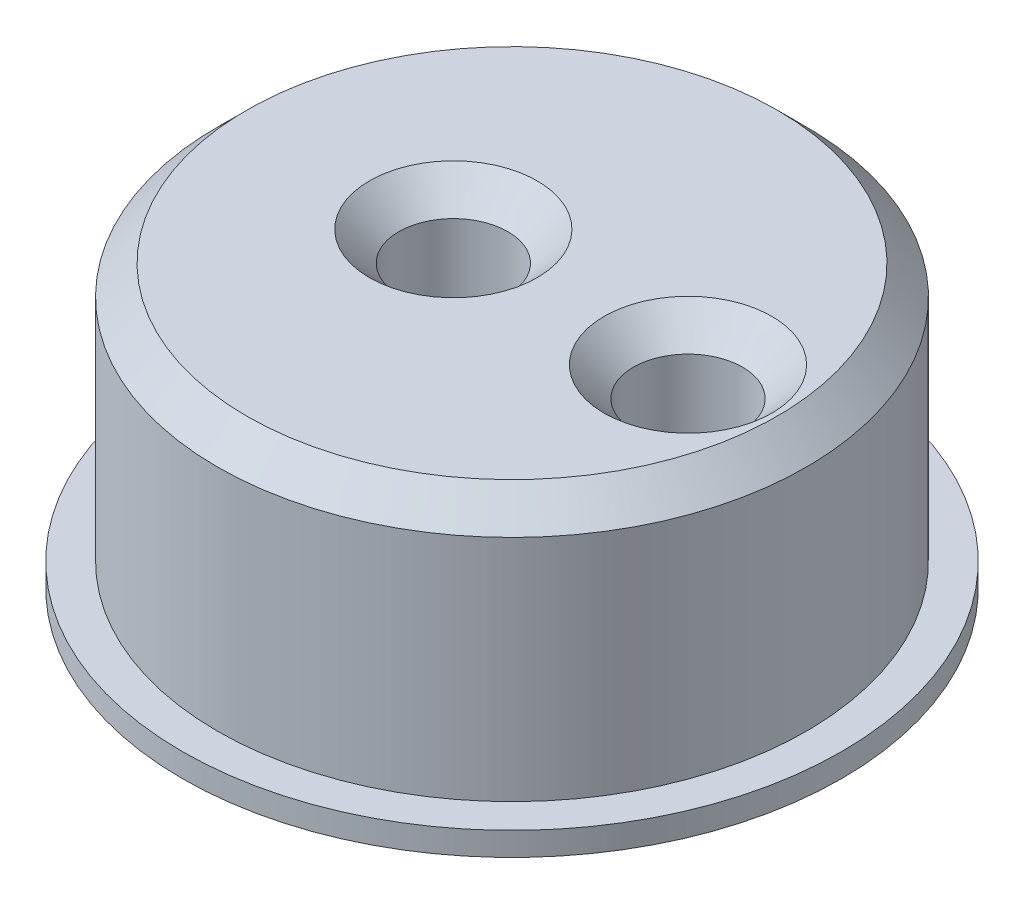
ISO-10303-21;
HEADER;
FILE_DESCRIPTION(('STEP AP214'),'2;1');
FILE_NAME('part.step','',(''),(''),'','','');
FILE_SCHEMA(('AUTOMOTIVE_DESIGN { 1 0 10303 214 1 1 1 1 }'));
ENDSEC;
DATA;
#1=APPLICATION_CONTEXT('core data for automotive mechanical design processes');
#2=APPLICATION_PROTOCOL_DEFINITION('international standard','automotive_design',2000,#1);
#3=PRODUCT_CONTEXT('',#1,'mechanical');
#4=PRODUCT('Part','Part','',(#3));
#5=PRODUCT_RELATED_PRODUCT_CATEGORY('part','',(#4));
#6=PRODUCT_DEFINITION_FORMATION('','',#4);
#7=PRODUCT_DEFINITION_CONTEXT('part definition',#1,'design');
#8=PRODUCT_DEFINITION('design','',#6,#7);
#9=PRODUCT_DEFINITION_SHAPE('','',#8);
#10=(LENGTH_UNIT() NAMED_UNIT(*) SI_UNIT(.MILLI.,.METRE.));
#11=(NAMED_UNIT(*) PLANE_ANGLE_UNIT() SI_UNIT($,.RADIAN.));
#12=(NAMED_UNIT(*) SI_UNIT($,.STERADIAN.) SOLID_ANGLE_UNIT());
#13=UNCERTAINTY_MEASURE_WITH_UNIT(LENGTH_MEASURE(1.E-05),#10,'distance_accuracy_value','');
#14=(GEOMETRIC_REPRESENTATION_CONTEXT(3) GLOBAL_UNCERTAINTY_ASSIGNED_CONTEXT((#13)) GLOBAL_UNIT_ASSIGNED_CONTEXT((#10,
#11,#12)) REPRESENTATION_CONTEXT('',''));
#15=CARTESIAN_POINT('',(0.,0.,0.));
#16=DIRECTION('',(0.,0.,1.));
#17=DIRECTION('',(1.,0.,0.));
#18=AXIS2_PLACEMENT_3D('',#15,#16,#17);
#19=CARTESIAN_POINT('',(0.,4.4,0.));
#20=DIRECTION('',(0.,1.,0.));
#21=DIRECTION('',(0.,0.,1.));
#22=AXIS2_PLACEMENT_3D('',#19,#20,#21);
#23=PLANE('',#22);
#24=CARTESIAN_POINT('',(-1.,4.4,0.));
#25=DIRECTION('',(0.,1.,0.));
#26=DIRECTION('',(0.,0.,1.));
#27=AXIS2_PLACEMENT_3D('',#24,#25,#26);
#28=CIRCLE('',#27,1.43000000000001);
#29=CARTESIAN_POINT('',(-1.,4.4,1.43000000000001));
#30=VERTEX_POINT('',#29);
#31=EDGE_CURVE('E42',#30,#30,#28,.F.);
#32=ORIENTED_EDGE('',*,*,#31,.T.);
#33=EDGE_LOOP('',(#32));
#34=FACE_BOUND('',#33,.T.);
#35=CARTESIAN_POINT('',(0.,4.4,0.));
#36=DIRECTION('',(0.,1.,0.));
#37=DIRECTION('',(0.,0.,1.));
#38=AXIS2_PLACEMENT_3D('',#35,#36,#37);
#39=CIRCLE('',#38,4.52);
#40=CARTESIAN_POINT('',(0.,4.4,4.52));
#41=VERTEX_POINT('',#40);
#42=EDGE_CURVE('E46',#41,#41,#39,.T.);
#43=ORIENTED_EDGE('',*,*,#42,.T.);
#44=EDGE_LOOP('',(#43));
#45=FACE_BOUND('',#44,.T.);
#46=CARTESIAN_POINT('',(3.,4.4,0.));
#47=DIRECTION('',(0.,1.,0.));
#48=DIRECTION('',(0.,0.,1.));
#49=AXIS2_PLACEMENT_3D('',#46,#47,#48);
#50=CIRCLE('',#49,1.43);
#51=CARTESIAN_POINT('',(3.,4.4,1.43));
#52=VERTEX_POINT('',#51);
#53=EDGE_CURVE('E50',#52,#52,#50,.F.);
#54=ORIENTED_EDGE('',*,*,#53,.T.);
#55=EDGE_LOOP('',(#54));
#56=FACE_BOUND('',#55,.T.);
#57=ADVANCED_FACE('F34',(#34,#45,#56),#23,.T.);
#58=CARTESIAN_POINT('',(0.,4.4,0.));
#59=DIRECTION('',(0.,-1.,0.));
#60=DIRECTION('',(0.,0.,-1.));
#61=AXIS2_PLACEMENT_3D('',#58,#59,#60);
#62=CYLINDRICAL_SURFACE('',#61,5.02);
#63=CARTESIAN_POINT('',(0.,3.9,0.));
#64=DIRECTION('',(0.,1.,0.));
#65=DIRECTION('',(0.,0.,1.));
#66=AXIS2_PLACEMENT_3D('',#63,#64,#65);
#67=CIRCLE('',#66,5.02);
#68=CARTESIAN_POINT('',(0.,3.9,5.02));
#69=VERTEX_POINT('',#68);
#70=EDGE_CURVE('E10',#69,#69,#67,.F.);
#71=ORIENTED_EDGE('',*,*,#70,.T.);
#72=EDGE_LOOP('',(#71));
#73=FACE_BOUND('',#72,.T.);
#74=CARTESIAN_POINT('',(0.,0.,0.));
#75=DIRECTION('',(0.,1.,0.));
#76=DIRECTION('',(0.,0.,1.));
#77=AXIS2_PLACEMENT_3D('',#74,#75,#76);
#78=CIRCLE('',#77,5.02);
#79=CARTESIAN_POINT('',(0.,0.,5.02));
#80=VERTEX_POINT('',#79);
#81=EDGE_CURVE('E73',#80,#80,#78,.T.);
#82=ORIENTED_EDGE('',*,*,#81,.T.);
#83=EDGE_LOOP('',(#82));
#84=FACE_BOUND('',#83,.T.);
#85=ADVANCED_FACE('F104',(#73,#84),#62,.T.);
#86=CARTESIAN_POINT('',(3.,4.4,0.));
#87=DIRECTION('',(0.,-1.,0.));
#88=DIRECTION('',(0.,0.,-1.));
#89=AXIS2_PLACEMENT_3D('',#86,#87,#88);
#90=CYLINDRICAL_SURFACE('',#89,0.930000000000001);
#91=CARTESIAN_POINT('',(3.,0.100000000000003,0.));
#92=DIRECTION('',(0.,-1.,0.));
#93=DIRECTION('',(0.,0.,-1.));
#94=AXIS2_PLACEMENT_3D('',#91,#92,#93);
#95=CIRCLE('',#94,0.930000000000001);
#96=CARTESIAN_POINT('',(3.,0.100000000000003,-0.930000000000001));
#97=VERTEX_POINT('',#96);
#98=EDGE_CURVE('E67',#97,#97,#95,.T.);
#99=ORIENTED_EDGE('',*,*,#98,.T.);
#100=EDGE_LOOP('',(#99));
#101=FACE_BOUND('',#100,.T.);
#102=CARTESIAN_POINT('',(3.,3.9,0.));
#103=DIRECTION('',(0.,1.,0.));
#104=DIRECTION('',(0.,0.,1.));
#105=AXIS2_PLACEMENT_3D('',#102,#103,#104);
#106=CIRCLE('',#105,0.930000000000001);
#107=CARTESIAN_POINT('',(3.,3.9,0.930000000000001));
#108=VERTEX_POINT('',#107);
#109=EDGE_CURVE('E70',#108,#108,#106,.T.);
#110=ORIENTED_EDGE('',*,*,#109,.T.);
#111=EDGE_LOOP('',(#110));
#112=FACE_BOUND('',#111,.T.);
#113=ADVANCED_FACE('F109',(#101,#112),#90,.F.);
#114=CARTESIAN_POINT('',(-1.,4.4,0.));
#115=DIRECTION('',(0.,-1.,0.));
#116=DIRECTION('',(0.,0.,-1.));
#117=AXIS2_PLACEMENT_3D('',#114,#115,#116);
#118=CYLINDRICAL_SURFACE('',#117,0.93);
#119=CARTESIAN_POINT('',(-1.,0.100000000000002,0.));
#120=DIRECTION('',(0.,-1.,0.));
#121=DIRECTION('',(0.,0.,-1.));
#122=AXIS2_PLACEMENT_3D('',#119,#120,#121);
#123=CIRCLE('',#122,0.93);
#124=CARTESIAN_POINT('',(-1.,0.100000000000002,-0.93));
#125=VERTEX_POINT('',#124);
#126=EDGE_CURVE('E55',#125,#125,#123,.T.);
#127=ORIENTED_EDGE('',*,*,#126,.T.);
#128=EDGE_LOOP('',(#127));
#129=FACE_BOUND('',#128,.T.);
#130=CARTESIAN_POINT('',(-1.,3.9,0.));
#131=DIRECTION('',(0.,1.,0.));
#132=DIRECTION('',(0.,0.,1.));
#133=AXIS2_PLACEMENT_3D('',#130,#131,#132);
#134=CIRCLE('',#133,0.93);
#135=CARTESIAN_POINT('',(-1.,3.9,0.930000000000001));
#136=VERTEX_POINT('',#135);
#137=EDGE_CURVE('E58',#136,#136,#134,.T.);
#138=ORIENTED_EDGE('',*,*,#137,.T.);
#139=EDGE_LOOP('',(#138));
#140=FACE_BOUND('',#139,.T.);
#141=ADVANCED_FACE('F99',(#129,#140),#118,.F.);
#142=CARTESIAN_POINT('',(0.,-0.4,0.));
#143=DIRECTION('',(0.,-1.,0.));
#144=DIRECTION('',(0.,0.,-1.));
#145=AXIS2_PLACEMENT_3D('',#142,#143,#144);
#146=PLANE('',#145);
#147=CARTESIAN_POINT('',(3.,-0.4,0.));
#148=DIRECTION('',(0.,-1.,0.));
#149=DIRECTION('',(0.,0.,-1.));
#150=AXIS2_PLACEMENT_3D('',#147,#148,#149);
#151=CIRCLE('',#150,1.43000000000001);
#152=CARTESIAN_POINT('',(3.,-0.4,-1.43000000000001));
#153=VERTEX_POINT('',#152);
#154=EDGE_CURVE('E61',#153,#153,#151,.F.);
#155=ORIENTED_EDGE('',*,*,#154,.T.);
#156=EDGE_LOOP('',(#155));
#157=FACE_BOUND('',#156,.T.);
#158=CARTESIAN_POINT('',(-1.,-0.4,0.));
#159=DIRECTION('',(0.,-1.,0.));
#160=DIRECTION('',(0.,0.,-1.));
#161=AXIS2_PLACEMENT_3D('',#158,#159,#160);
#162=CIRCLE('',#161,1.43);
#163=CARTESIAN_POINT('',(-1.,-0.4,-1.43));
#164=VERTEX_POINT('',#163);
#165=EDGE_CURVE('E64',#164,#164,#162,.F.);
#166=ORIENTED_EDGE('',*,*,#165,.T.);
#167=EDGE_LOOP('',(#166));
#168=FACE_BOUND('',#167,.T.);
#169=CARTESIAN_POINT('',(0.,-0.4,0.));
#170=DIRECTION('',(0.,-1.,0.));
#171=DIRECTION('',(0.,0.,-1.));
#172=AXIS2_PLACEMENT_3D('',#169,#170,#171);
#173=CIRCLE('',#172,5.62);
#174=CARTESIAN_POINT('',(0.,-0.4,-5.62));
#175=VERTEX_POINT('',#174);
#176=EDGE_CURVE('E76',#175,#175,#173,.T.);
#177=ORIENTED_EDGE('',*,*,#176,.T.);
#178=EDGE_LOOP('',(#177));
#179=FACE_BOUND('',#178,.T.);
#180=ADVANCED_FACE('F83',(#157,#168,#179),#146,.T.);
#181=CARTESIAN_POINT('',(0.,0.,0.));
#182=DIRECTION('',(0.,-1.,0.));
#183=DIRECTION('',(0.,0.,-1.));
#184=AXIS2_PLACEMENT_3D('',#181,#182,#183);
#185=PLANE('',#184);
#186=ORIENTED_EDGE('',*,*,#81,.F.);
#187=EDGE_LOOP('',(#186));
#188=FACE_BOUND('',#187,.T.);
#189=CARTESIAN_POINT('',(0.,0.,0.));
#190=DIRECTION('',(0.,-1.,0.));
#191=DIRECTION('',(0.,0.,-1.));
#192=AXIS2_PLACEMENT_3D('',#189,#190,#191);
#193=CIRCLE('',#192,5.62);
#194=CARTESIAN_POINT('',(0.,0.,-5.62));
#195=VERTEX_POINT('',#194);
#196=EDGE_CURVE('E77',#195,#195,#193,.T.);
#197=ORIENTED_EDGE('',*,*,#196,.F.);
#198=EDGE_LOOP('',(#197));
#199=FACE_BOUND('',#198,.T.);
#200=ADVANCED_FACE('F89',(#188,#199),#185,.F.);
#201=CARTESIAN_POINT('',(0.,-0.4,0.));
#202=DIRECTION('',(0.,1.,0.));
#203=DIRECTION('',(0.,0.,1.));
#204=AXIS2_PLACEMENT_3D('',#201,#202,#203);
#205=CYLINDRICAL_SURFACE('',#204,5.62);
#206=ORIENTED_EDGE('',*,*,#176,.F.);
#207=EDGE_LOOP('',(#206));
#208=FACE_BOUND('',#207,.T.);
#209=ORIENTED_EDGE('',*,*,#196,.T.);
#210=EDGE_LOOP('',(#209));
#211=FACE_BOUND('',#210,.T.);
#212=ADVANCED_FACE('F85',(#208,#211),#205,.T.);
#213=CARTESIAN_POINT('',(3.,0.100000000000003,0.));
#214=DIRECTION('',(0.,-1.,0.));
#215=DIRECTION('',(0.,0.,-1.));
#216=AXIS2_PLACEMENT_3D('',#213,#214,#215);
#217=CONICAL_SURFACE('',#216,0.930000000000001,0.78539816339745);
#218=ORIENTED_EDGE('',*,*,#154,.F.);
#219=EDGE_LOOP('',(#218));
#220=FACE_BOUND('',#219,.T.);
#221=ORIENTED_EDGE('',*,*,#98,.F.);
#222=EDGE_LOOP('',(#221));
#223=FACE_BOUND('',#222,.T.);
#224=ADVANCED_FACE('F88',(#220,#223),#217,.F.);
#225=CARTESIAN_POINT('',(-1.,0.100000000000002,0.));
#226=DIRECTION('',(0.,-1.,0.));
#227=DIRECTION('',(0.,0.,-1.));
#228=AXIS2_PLACEMENT_3D('',#225,#226,#227);
#229=CONICAL_SURFACE('',#228,0.93,0.785398163397448);
#230=ORIENTED_EDGE('',*,*,#165,.F.);
#231=EDGE_LOOP('',(#230));
#232=FACE_BOUND('',#231,.T.);
#233=ORIENTED_EDGE('',*,*,#126,.F.);
#234=EDGE_LOOP('',(#233));
#235=FACE_BOUND('',#234,.T.);
#236=ADVANCED_FACE('F121',(#232,#235),#229,.F.);
#237=CARTESIAN_POINT('',(-1.,3.9,0.));
#238=DIRECTION('',(0.,1.,0.));
#239=DIRECTION('',(0.,0.,1.));
#240=AXIS2_PLACEMENT_3D('',#237,#238,#239);
#241=CONICAL_SURFACE('',#240,0.93,0.78539816339745);
#242=ORIENTED_EDGE('',*,*,#31,.F.);
#243=EDGE_LOOP('',(#242));
#244=FACE_BOUND('',#243,.T.);
#245=ORIENTED_EDGE('',*,*,#137,.F.);
#246=EDGE_LOOP('',(#245));
#247=FACE_BOUND('',#246,.T.);
#248=ADVANCED_FACE('F128',(#244,#247),#241,.F.);
#249=CARTESIAN_POINT('',(0.,4.4,0.));
#250=DIRECTION('',(0.,-1.,0.));
#251=DIRECTION('',(0.,0.,-1.));
#252=AXIS2_PLACEMENT_3D('',#249,#250,#251);
#253=CONICAL_SURFACE('',#252,4.52,0.785398163397448);
#254=ORIENTED_EDGE('',*,*,#70,.F.);
#255=EDGE_LOOP('',(#254));
#256=FACE_BOUND('',#255,.T.);
#257=ORIENTED_EDGE('',*,*,#42,.F.);
#258=EDGE_LOOP('',(#257));
#259=FACE_BOUND('',#258,.T.);
#260=ADVANCED_FACE('F134',(#256,#259),#253,.T.);
#261=CARTESIAN_POINT('',(3.,3.9,0.));
#262=DIRECTION('',(0.,1.,0.));
#263=DIRECTION('',(0.,0.,1.));
#264=AXIS2_PLACEMENT_3D('',#261,#262,#263);
#265=CONICAL_SURFACE('',#264,0.930000000000001,0.785398163397448);
#266=ORIENTED_EDGE('',*,*,#53,.F.);
#267=EDGE_LOOP('',(#266));
#268=FACE_BOUND('',#267,.T.);
#269=ORIENTED_EDGE('',*,*,#109,.F.);
#270=EDGE_LOOP('',(#269));
#271=FACE_BOUND('',#270,.T.);
#272=ADVANCED_FACE('F37',(#268,#271),#265,.F.);
#273=CLOSED_SHELL('',(#57,#85,#113,#141,#180,#200,#212,#224,#236,#248,#260,#272));
#274=MANIFOLD_SOLID_BREP('B2',#273);
#275=ADVANCED_BREP_SHAPE_REPRESENTATION('',(#18,#274),#14);
#276=SHAPE_DEFINITION_REPRESENTATION(#9,#275);
ENDSEC;
END-ISO-10303-21;
